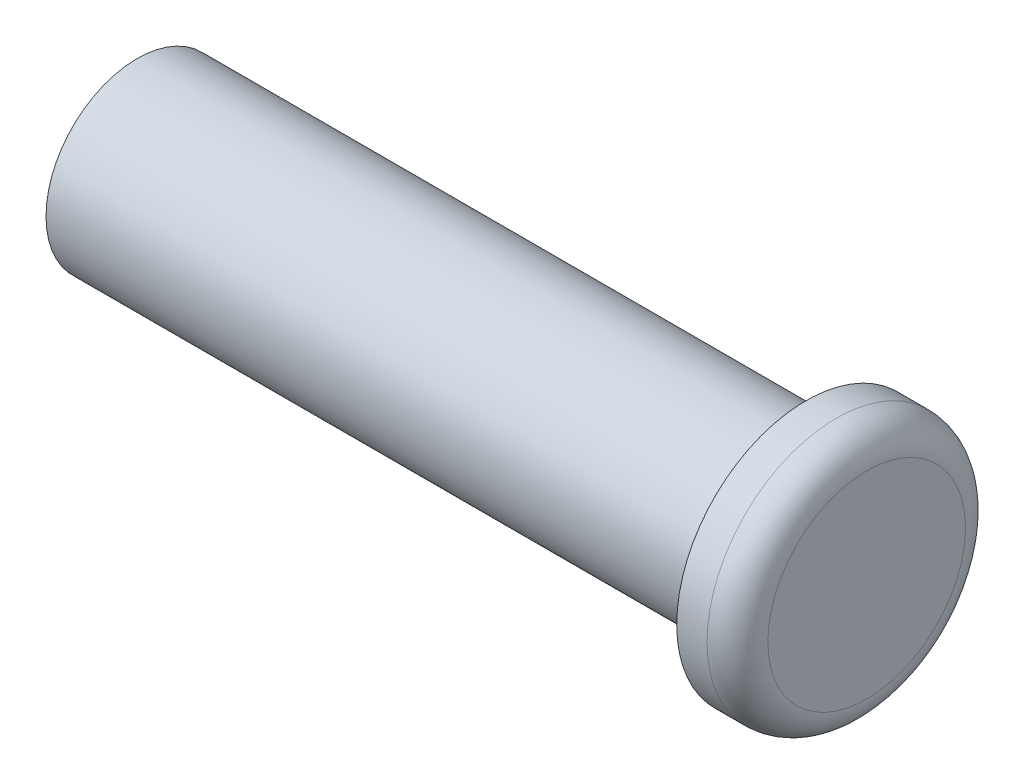
ISO-10303-21;
HEADER;
FILE_DESCRIPTION(('STEP AP214'),'2;1');
FILE_NAME('part.step','',(''),(''),'','','');
FILE_SCHEMA(('AUTOMOTIVE_DESIGN { 1 0 10303 214 1 1 1 1 }'));
ENDSEC;
DATA;
#1=APPLICATION_CONTEXT('core data for automotive mechanical design processes');
#2=APPLICATION_PROTOCOL_DEFINITION('international standard','automotive_design',2000,#1);
#3=PRODUCT_CONTEXT('',#1,'mechanical');
#4=PRODUCT('Part','Part','',(#3));
#5=PRODUCT_RELATED_PRODUCT_CATEGORY('part','',(#4));
#6=PRODUCT_DEFINITION_FORMATION('','',#4);
#7=PRODUCT_DEFINITION_CONTEXT('part definition',#1,'design');
#8=PRODUCT_DEFINITION('design','',#6,#7);
#9=PRODUCT_DEFINITION_SHAPE('','',#8);
#10=(LENGTH_UNIT() NAMED_UNIT(*) SI_UNIT(.MILLI.,.METRE.));
#11=(NAMED_UNIT(*) PLANE_ANGLE_UNIT() SI_UNIT($,.RADIAN.));
#12=(NAMED_UNIT(*) SI_UNIT($,.STERADIAN.) SOLID_ANGLE_UNIT());
#13=UNCERTAINTY_MEASURE_WITH_UNIT(LENGTH_MEASURE(1.E-05),#10,'distance_accuracy_value','');
#14=(GEOMETRIC_REPRESENTATION_CONTEXT(3) GLOBAL_UNCERTAINTY_ASSIGNED_CONTEXT((#13)) GLOBAL_UNIT_ASSIGNED_CONTEXT((#10,
#11,#12)) REPRESENTATION_CONTEXT('',''));
#15=CARTESIAN_POINT('',(0.,0.,0.));
#16=DIRECTION('',(0.,0.,1.));
#17=DIRECTION('',(1.,0.,0.));
#18=AXIS2_PLACEMENT_3D('',#15,#16,#17);
#19=CARTESIAN_POINT('',(11.,0.,0.));
#20=DIRECTION('',(-1.,0.,0.));
#21=DIRECTION('',(0.,0.,-1.));
#22=AXIS2_PLACEMENT_3D('',#19,#20,#21);
#23=CYLINDRICAL_SURFACE('',#22,3.);
#24=CARTESIAN_POINT('',(11.,0.,0.));
#25=DIRECTION('',(-1.,0.,0.));
#26=DIRECTION('',(0.,0.,1.));
#27=AXIS2_PLACEMENT_3D('',#24,#25,#26);
#28=CIRCLE('',#27,3.);
#29=CARTESIAN_POINT('',(11.,0.,3.));
#30=VERTEX_POINT('',#29);
#31=EDGE_CURVE('E44',#30,#30,#28,.T.);
#32=ORIENTED_EDGE('',*,*,#31,.T.);
#33=EDGE_LOOP('',(#32));
#34=FACE_BOUND('',#33,.T.);
#35=CARTESIAN_POINT('',(-11.,0.,0.));
#36=DIRECTION('',(-1.,0.,0.));
#37=DIRECTION('',(0.,0.,1.));
#38=AXIS2_PLACEMENT_3D('',#35,#36,#37);
#39=CIRCLE('',#38,3.);
#40=CARTESIAN_POINT('',(-11.,0.,3.));
#41=VERTEX_POINT('',#40);
#42=EDGE_CURVE('E48',#41,#41,#39,.T.);
#43=ORIENTED_EDGE('',*,*,#42,.F.);
#44=EDGE_LOOP('',(#43));
#45=FACE_BOUND('',#44,.T.);
#46=ADVANCED_FACE('F33',(#34,#45),#23,.T.);
#47=CARTESIAN_POINT('',(-11.,0.,0.));
#48=DIRECTION('',(1.,0.,0.));
#49=DIRECTION('',(0.,0.,1.));
#50=AXIS2_PLACEMENT_3D('',#47,#48,#49);
#51=PLANE('',#50);
#52=ORIENTED_EDGE('',*,*,#42,.T.);
#53=EDGE_LOOP('',(#52));
#54=FACE_BOUND('',#53,.T.);
#55=ADVANCED_FACE('F62',(#54),#51,.F.);
#56=CARTESIAN_POINT('',(13.,0.,0.));
#57=DIRECTION('',(-1.,0.,0.));
#58=DIRECTION('',(0.,0.,-1.));
#59=AXIS2_PLACEMENT_3D('',#56,#57,#58);
#60=CYLINDRICAL_SURFACE('',#59,4.25);
#61=CARTESIAN_POINT('',(12.,0.,0.));
#62=DIRECTION('',(-1.,0.,0.));
#63=DIRECTION('',(0.,0.,1.));
#64=AXIS2_PLACEMENT_3D('',#61,#62,#63);
#65=CIRCLE('',#64,4.25);
#66=CARTESIAN_POINT('',(12.,0.,4.25));
#67=VERTEX_POINT('',#66);
#68=EDGE_CURVE('E10',#67,#67,#65,.F.);
#69=ORIENTED_EDGE('',*,*,#68,.F.);
#70=EDGE_LOOP('',(#69));
#71=FACE_BOUND('',#70,.T.);
#72=CARTESIAN_POINT('',(11.,0.,0.));
#73=DIRECTION('',(-1.,0.,0.));
#74=DIRECTION('',(0.,0.,1.));
#75=AXIS2_PLACEMENT_3D('',#72,#73,#74);
#76=CIRCLE('',#75,4.25);
#77=CARTESIAN_POINT('',(11.,0.,4.25));
#78=VERTEX_POINT('',#77);
#79=EDGE_CURVE('E52',#78,#78,#76,.T.);
#80=ORIENTED_EDGE('',*,*,#79,.F.);
#81=EDGE_LOOP('',(#80));
#82=FACE_BOUND('',#81,.T.);
#83=ADVANCED_FACE('F59',(#71,#82),#60,.T.);
#84=CARTESIAN_POINT('',(13.,0.,0.));
#85=DIRECTION('',(1.,0.,0.));
#86=DIRECTION('',(0.,0.,1.));
#87=AXIS2_PLACEMENT_3D('',#84,#85,#86);
#88=PLANE('',#87);
#89=CARTESIAN_POINT('',(13.,0.,0.));
#90=DIRECTION('',(-1.,0.,0.));
#91=DIRECTION('',(0.,0.,1.));
#92=AXIS2_PLACEMENT_3D('',#89,#90,#91);
#93=CIRCLE('',#92,3.25);
#94=CARTESIAN_POINT('',(13.,0.,3.25));
#95=VERTEX_POINT('',#94);
#96=EDGE_CURVE('E40',#95,#95,#93,.T.);
#97=ORIENTED_EDGE('',*,*,#96,.F.);
#98=EDGE_LOOP('',(#97));
#99=FACE_BOUND('',#98,.T.);
#100=ADVANCED_FACE('F61',(#99),#88,.T.);
#101=CARTESIAN_POINT('',(11.,0.,0.));
#102=DIRECTION('',(1.,0.,0.));
#103=DIRECTION('',(0.,0.,1.));
#104=AXIS2_PLACEMENT_3D('',#101,#102,#103);
#105=PLANE('',#104);
#106=ORIENTED_EDGE('',*,*,#31,.F.);
#107=EDGE_LOOP('',(#106));
#108=FACE_BOUND('',#107,.T.);
#109=ORIENTED_EDGE('',*,*,#79,.T.);
#110=EDGE_LOOP('',(#109));
#111=FACE_BOUND('',#110,.T.);
#112=ADVANCED_FACE('F57',(#108,#111),#105,.F.);
#113=CARTESIAN_POINT('',(12.,0.,0.));
#114=DIRECTION('',(1.,0.,0.));
#115=DIRECTION('',(0.,0.,1.));
#116=AXIS2_PLACEMENT_3D('',#113,#114,#115);
#117=TOROIDAL_SURFACE('',#116,3.25,1.);
#118=ORIENTED_EDGE('',*,*,#68,.T.);
#119=EDGE_LOOP('',(#118));
#120=FACE_BOUND('',#119,.T.);
#121=ORIENTED_EDGE('',*,*,#96,.T.);
#122=EDGE_LOOP('',(#121));
#123=FACE_BOUND('',#122,.T.);
#124=ADVANCED_FACE('F35',(#120,#123),#117,.T.);
#125=CLOSED_SHELL('',(#46,#55,#83,#100,#112,#124));
#126=MANIFOLD_SOLID_BREP('B2',#125);
#127=ADVANCED_BREP_SHAPE_REPRESENTATION('',(#18,#126),#14);
#128=SHAPE_DEFINITION_REPRESENTATION(#9,#127);
ENDSEC;
END-ISO-10303-21;
